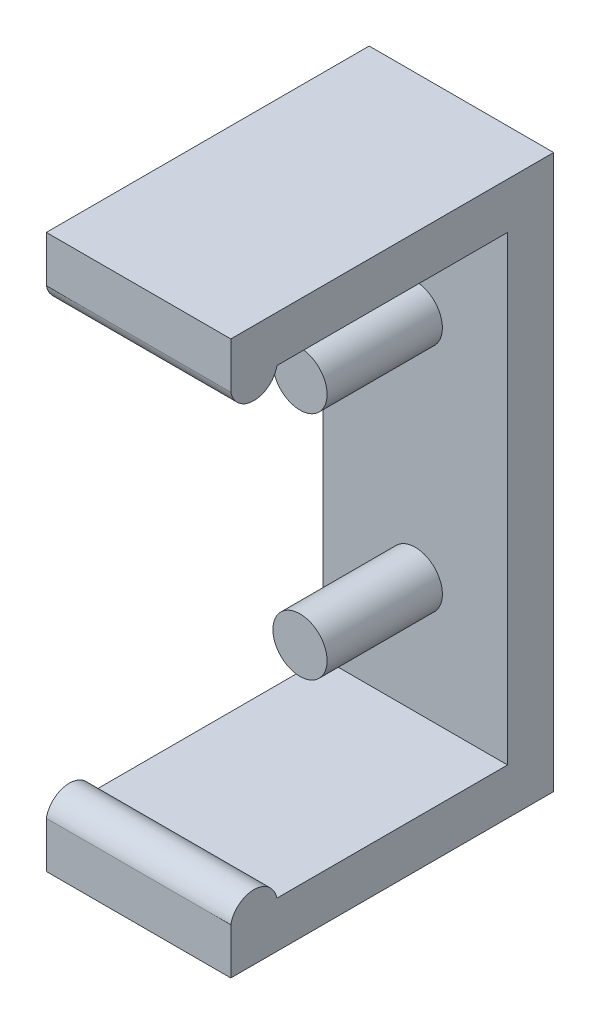
ISO-10303-21;
HEADER;
FILE_DESCRIPTION(('STEP AP214'),'2;1');
FILE_NAME('part.step','',(''),(''),'','','');
FILE_SCHEMA(('AUTOMOTIVE_DESIGN { 1 0 10303 214 1 1 1 1 }'));
ENDSEC;
DATA;
#1=APPLICATION_CONTEXT('core data for automotive mechanical design processes');
#2=APPLICATION_PROTOCOL_DEFINITION('international standard','automotive_design',2000,#1);
#3=PRODUCT_CONTEXT('',#1,'mechanical');
#4=PRODUCT('Part','Part','',(#3));
#5=PRODUCT_RELATED_PRODUCT_CATEGORY('part','',(#4));
#6=PRODUCT_DEFINITION_FORMATION('','',#4);
#7=PRODUCT_DEFINITION_CONTEXT('part definition',#1,'design');
#8=PRODUCT_DEFINITION('design','',#6,#7);
#9=PRODUCT_DEFINITION_SHAPE('','',#8);
#10=(LENGTH_UNIT() NAMED_UNIT(*) SI_UNIT(.MILLI.,.METRE.));
#11=(NAMED_UNIT(*) PLANE_ANGLE_UNIT() SI_UNIT($,.RADIAN.));
#12=(NAMED_UNIT(*) SI_UNIT($,.STERADIAN.) SOLID_ANGLE_UNIT());
#13=UNCERTAINTY_MEASURE_WITH_UNIT(LENGTH_MEASURE(1.E-05),#10,'distance_accuracy_value','');
#14=(GEOMETRIC_REPRESENTATION_CONTEXT(3) GLOBAL_UNCERTAINTY_ASSIGNED_CONTEXT((#13)) GLOBAL_UNIT_ASSIGNED_CONTEXT((#10,
#11,#12)) REPRESENTATION_CONTEXT('',''));
#15=CARTESIAN_POINT('',(0.,0.,0.));
#16=DIRECTION('',(0.,0.,1.));
#17=DIRECTION('',(1.,0.,0.));
#18=AXIS2_PLACEMENT_3D('',#15,#16,#17);
#19=CARTESIAN_POINT('',(-4.,10.,14.));
#20=DIRECTION('',(0.,1.,0.));
#21=DIRECTION('',(0.,0.,1.));
#22=AXIS2_PLACEMENT_3D('',#19,#20,#21);
#23=PLANE('',#22);
#24=DIRECTION('',(1.,0.,0.));
#25=VECTOR('',#24,1.);
#26=CARTESIAN_POINT('',(-6.16119528841294,10.,12.));
#27=LINE('',#26,#25);
#28=CARTESIAN_POINT('',(-4.,10.,12.));
#29=VERTEX_POINT('',#28);
#30=CARTESIAN_POINT('',(4.,10.,12.));
#31=VERTEX_POINT('',#30);
#32=EDGE_CURVE('E251',#29,#31,#27,.T.);
#33=ORIENTED_EDGE('',*,*,#32,.F.);
#34=DIRECTION('',(0.,0.,-1.));
#35=VECTOR('',#34,1.);
#36=CARTESIAN_POINT('',(-4.,10.,14.));
#37=LINE('',#36,#35);
#38=CARTESIAN_POINT('',(-4.,10.,2.));
#39=VERTEX_POINT('',#38);
#40=EDGE_CURVE('E63',#29,#39,#37,.T.);
#41=ORIENTED_EDGE('',*,*,#40,.T.);
#42=DIRECTION('',(1.,0.,0.));
#43=VECTOR('',#42,1.);
#44=CARTESIAN_POINT('',(-4.,10.,2.));
#45=LINE('',#44,#43);
#46=CARTESIAN_POINT('',(4.,10.,2.));
#47=VERTEX_POINT('',#46);
#48=EDGE_CURVE('E162',#39,#47,#45,.T.);
#49=ORIENTED_EDGE('',*,*,#48,.T.);
#50=DIRECTION('',(0.,0.,-1.));
#51=VECTOR('',#50,1.);
#52=CARTESIAN_POINT('',(4.,10.,14.));
#53=LINE('',#52,#51);
#54=EDGE_CURVE('E234',#31,#47,#53,.T.);
#55=ORIENTED_EDGE('',*,*,#54,.F.);
#56=EDGE_LOOP('',(#33,#41,#49,#55));
#57=FACE_BOUND('',#56,.T.);
#58=ADVANCED_FACE('F47',(#57),#23,.F.);
#59=CARTESIAN_POINT('',(4.,12.,2.));
#60=DIRECTION('',(-1.,0.,0.));
#61=DIRECTION('',(0.,-1.,0.));
#62=AXIS2_PLACEMENT_3D('',#59,#60,#61);
#63=PLANE('',#62);
#64=DIRECTION('',(0.,1.,0.));
#65=VECTOR('',#64,1.);
#66=CARTESIAN_POINT('',(4.,12.,0.));
#67=LINE('',#66,#65);
#68=CARTESIAN_POINT('',(4.,-12.,0.));
#69=VERTEX_POINT('',#68);
#70=CARTESIAN_POINT('',(4.,12.,0.));
#71=VERTEX_POINT('',#70);
#72=EDGE_CURVE('E184',#69,#71,#67,.T.);
#73=ORIENTED_EDGE('',*,*,#72,.T.);
#74=DIRECTION('',(0.,0.,-1.));
#75=VECTOR('',#74,1.);
#76=CARTESIAN_POINT('',(4.,12.,2.));
#77=LINE('',#76,#75);
#78=CARTESIAN_POINT('',(4.,12.,14.));
#79=VERTEX_POINT('',#78);
#80=EDGE_CURVE('E11',#79,#71,#77,.T.);
#81=ORIENTED_EDGE('',*,*,#80,.F.);
#82=DIRECTION('',(0.,1.,0.));
#83=VECTOR('',#82,1.);
#84=CARTESIAN_POINT('',(4.,12.,14.));
#85=LINE('',#84,#83);
#86=CARTESIAN_POINT('',(4.,10.,14.));
#87=VERTEX_POINT('',#86);
#88=EDGE_CURVE('E239',#87,#79,#85,.T.);
#89=ORIENTED_EDGE('',*,*,#88,.F.);
#90=CARTESIAN_POINT('',(4.,10.2009975124224,13.));
#91=DIRECTION('',(-1.,0.,0.));
#92=DIRECTION('',(0.,-1.,0.));
#93=AXIS2_PLACEMENT_3D('',#90,#91,#92);
#94=CIRCLE('',#93,1.02);
#95=EDGE_CURVE('E139',#31,#87,#94,.T.);
#96=ORIENTED_EDGE('',*,*,#95,.F.);
#97=ORIENTED_EDGE('',*,*,#54,.T.);
#98=DIRECTION('',(0.,1.,0.));
#99=VECTOR('',#98,1.);
#100=CARTESIAN_POINT('',(4.,12.,2.));
#101=LINE('',#100,#99);
#102=CARTESIAN_POINT('',(4.,-10.,2.));
#103=VERTEX_POINT('',#102);
#104=EDGE_CURVE('E149',#103,#47,#101,.T.);
#105=ORIENTED_EDGE('',*,*,#104,.F.);
#106=DIRECTION('',(0.,0.,-1.));
#107=VECTOR('',#106,1.);
#108=CARTESIAN_POINT('',(4.,-10.,14.));
#109=LINE('',#108,#107);
#110=CARTESIAN_POINT('',(4.,-10.,12.));
#111=VERTEX_POINT('',#110);
#112=EDGE_CURVE('E71',#111,#103,#109,.T.);
#113=ORIENTED_EDGE('',*,*,#112,.F.);
#114=CARTESIAN_POINT('',(4.,-10.2009975124224,13.));
#115=DIRECTION('',(1.,0.,0.));
#116=DIRECTION('',(0.,1.,0.));
#117=AXIS2_PLACEMENT_3D('',#114,#115,#116);
#118=CIRCLE('',#117,1.02);
#119=CARTESIAN_POINT('',(4.,-10.,14.));
#120=VERTEX_POINT('',#119);
#121=EDGE_CURVE('E129',#111,#120,#118,.T.);
#122=ORIENTED_EDGE('',*,*,#121,.T.);
#123=DIRECTION('',(0.,1.,0.));
#124=VECTOR('',#123,1.);
#125=CARTESIAN_POINT('',(4.,-12.,14.));
#126=LINE('',#125,#124);
#127=CARTESIAN_POINT('',(4.,-12.,14.));
#128=VERTEX_POINT('',#127);
#129=EDGE_CURVE('E166',#128,#120,#126,.T.);
#130=ORIENTED_EDGE('',*,*,#129,.F.);
#131=DIRECTION('',(0.,0.,-1.));
#132=VECTOR('',#131,1.);
#133=CARTESIAN_POINT('',(4.,-12.,2.));
#134=LINE('',#133,#132);
#135=EDGE_CURVE('E183',#128,#69,#134,.T.);
#136=ORIENTED_EDGE('',*,*,#135,.T.);
#137=EDGE_LOOP('',(#73,#81,#89,#96,#97,#105,#113,#122,#130,#136));
#138=FACE_BOUND('',#137,.T.);
#139=ADVANCED_FACE('F49',(#138),#63,.F.);
#140=CARTESIAN_POINT('',(-4.,12.,2.));
#141=DIRECTION('',(0.,-1.,0.));
#142=DIRECTION('',(0.,0.,-1.));
#143=AXIS2_PLACEMENT_3D('',#140,#141,#142);
#144=PLANE('',#143);
#145=DIRECTION('',(-1.,0.,0.));
#146=VECTOR('',#145,1.);
#147=CARTESIAN_POINT('',(-4.,12.,0.));
#148=LINE('',#147,#146);
#149=CARTESIAN_POINT('',(-4.,12.,0.));
#150=VERTEX_POINT('',#149);
#151=EDGE_CURVE('E187',#71,#150,#148,.T.);
#152=ORIENTED_EDGE('',*,*,#151,.T.);
#153=DIRECTION('',(0.,0.,-1.));
#154=VECTOR('',#153,1.);
#155=CARTESIAN_POINT('',(-4.,12.,2.));
#156=LINE('',#155,#154);
#157=CARTESIAN_POINT('',(-4.,12.,14.));
#158=VERTEX_POINT('',#157);
#159=EDGE_CURVE('E56',#158,#150,#156,.T.);
#160=ORIENTED_EDGE('',*,*,#159,.F.);
#161=DIRECTION('',(-1.,0.,0.));
#162=VECTOR('',#161,1.);
#163=CARTESIAN_POINT('',(-4.,12.,14.));
#164=LINE('',#163,#162);
#165=EDGE_CURVE('E232',#79,#158,#164,.T.);
#166=ORIENTED_EDGE('',*,*,#165,.F.);
#167=ORIENTED_EDGE('',*,*,#80,.T.);
#168=EDGE_LOOP('',(#152,#160,#166,#167));
#169=FACE_BOUND('',#168,.T.);
#170=ADVANCED_FACE('F306',(#169),#144,.F.);
#171=CARTESIAN_POINT('',(-4.,12.,2.));
#172=DIRECTION('',(1.,0.,0.));
#173=DIRECTION('',(0.,1.,0.));
#174=AXIS2_PLACEMENT_3D('',#171,#172,#173);
#175=PLANE('',#174);
#176=DIRECTION('',(0.,-1.,0.));
#177=VECTOR('',#176,1.);
#178=CARTESIAN_POINT('',(-4.,12.,0.));
#179=LINE('',#178,#177);
#180=CARTESIAN_POINT('',(-4.,-12.,0.));
#181=VERTEX_POINT('',#180);
#182=EDGE_CURVE('E190',#150,#181,#179,.T.);
#183=ORIENTED_EDGE('',*,*,#182,.T.);
#184=DIRECTION('',(0.,0.,-1.));
#185=VECTOR('',#184,1.);
#186=CARTESIAN_POINT('',(-4.,-12.,2.));
#187=LINE('',#186,#185);
#188=CARTESIAN_POINT('',(-4.,-12.,14.));
#189=VERTEX_POINT('',#188);
#190=EDGE_CURVE('E198',#189,#181,#187,.T.);
#191=ORIENTED_EDGE('',*,*,#190,.F.);
#192=DIRECTION('',(0.,-1.,0.));
#193=VECTOR('',#192,1.);
#194=CARTESIAN_POINT('',(-4.,-12.,14.));
#195=LINE('',#194,#193);
#196=CARTESIAN_POINT('',(-4.,-10.,14.));
#197=VERTEX_POINT('',#196);
#198=EDGE_CURVE('E163',#197,#189,#195,.T.);
#199=ORIENTED_EDGE('',*,*,#198,.F.);
#200=CARTESIAN_POINT('',(-4.,-10.2009975124224,13.));
#201=DIRECTION('',(1.,0.,0.));
#202=DIRECTION('',(0.,1.,0.));
#203=AXIS2_PLACEMENT_3D('',#200,#201,#202);
#204=CIRCLE('',#203,1.02);
#205=CARTESIAN_POINT('',(-4.,-10.,12.));
#206=VERTEX_POINT('',#205);
#207=EDGE_CURVE('E144',#197,#206,#204,.F.);
#208=ORIENTED_EDGE('',*,*,#207,.T.);
#209=DIRECTION('',(0.,0.,-1.));
#210=VECTOR('',#209,1.);
#211=CARTESIAN_POINT('',(-4.,-10.,14.));
#212=LINE('',#211,#210);
#213=CARTESIAN_POINT('',(-4.,-10.,2.));
#214=VERTEX_POINT('',#213);
#215=EDGE_CURVE('E142',#206,#214,#212,.T.);
#216=ORIENTED_EDGE('',*,*,#215,.T.);
#217=DIRECTION('',(0.,-1.,0.));
#218=VECTOR('',#217,1.);
#219=CARTESIAN_POINT('',(-4.,12.,2.));
#220=LINE('',#219,#218);
#221=EDGE_CURVE('E178',#39,#214,#220,.T.);
#222=ORIENTED_EDGE('',*,*,#221,.F.);
#223=ORIENTED_EDGE('',*,*,#40,.F.);
#224=CARTESIAN_POINT('',(-4.,10.2009975124224,13.));
#225=DIRECTION('',(1.,0.,0.));
#226=DIRECTION('',(0.,1.,0.));
#227=AXIS2_PLACEMENT_3D('',#224,#225,#226);
#228=CIRCLE('',#227,1.02);
#229=CARTESIAN_POINT('',(-4.,10.,14.));
#230=VERTEX_POINT('',#229);
#231=EDGE_CURVE('E248',#230,#29,#228,.T.);
#232=ORIENTED_EDGE('',*,*,#231,.F.);
#233=DIRECTION('',(0.,-1.,0.));
#234=VECTOR('',#233,1.);
#235=CARTESIAN_POINT('',(-4.,12.,14.));
#236=LINE('',#235,#234);
#237=EDGE_CURVE('E208',#158,#230,#236,.T.);
#238=ORIENTED_EDGE('',*,*,#237,.F.);
#239=ORIENTED_EDGE('',*,*,#159,.T.);
#240=EDGE_LOOP('',(#183,#191,#199,#208,#216,#222,#223,#232,#238,#239));
#241=FACE_BOUND('',#240,.T.);
#242=ADVANCED_FACE('F206',(#241),#175,.F.);
#243=CARTESIAN_POINT('',(-4.,-12.,2.));
#244=DIRECTION('',(0.,1.,0.));
#245=DIRECTION('',(0.,0.,1.));
#246=AXIS2_PLACEMENT_3D('',#243,#244,#245);
#247=PLANE('',#246);
#248=DIRECTION('',(1.,0.,0.));
#249=VECTOR('',#248,1.);
#250=CARTESIAN_POINT('',(-4.,-12.,0.));
#251=LINE('',#250,#249);
#252=EDGE_CURVE('E179',#181,#69,#251,.T.);
#253=ORIENTED_EDGE('',*,*,#252,.T.);
#254=ORIENTED_EDGE('',*,*,#135,.F.);
#255=DIRECTION('',(1.,0.,0.));
#256=VECTOR('',#255,1.);
#257=CARTESIAN_POINT('',(-4.,-12.,14.));
#258=LINE('',#257,#256);
#259=EDGE_CURVE('E169',#189,#128,#258,.T.);
#260=ORIENTED_EDGE('',*,*,#259,.F.);
#261=ORIENTED_EDGE('',*,*,#190,.T.);
#262=EDGE_LOOP('',(#253,#254,#260,#261));
#263=FACE_BOUND('',#262,.T.);
#264=ADVANCED_FACE('F217',(#263),#247,.F.);
#265=CARTESIAN_POINT('',(0.,0.,2.));
#266=DIRECTION('',(0.,0.,1.));
#267=DIRECTION('',(1.,0.,0.));
#268=AXIS2_PLACEMENT_3D('',#265,#266,#267);
#269=PLANE('',#268);
#270=CARTESIAN_POINT('',(0.,-5.,2.));
#271=DIRECTION('',(0.,0.,1.));
#272=DIRECTION('',(1.,0.,0.));
#273=AXIS2_PLACEMENT_3D('',#270,#271,#272);
#274=CIRCLE('',#273,1.175);
#275=CARTESIAN_POINT('',(1.175,-5.,2.));
#276=VERTEX_POINT('',#275);
#277=EDGE_CURVE('E265',#276,#276,#274,.T.);
#278=ORIENTED_EDGE('',*,*,#277,.F.);
#279=EDGE_LOOP('',(#278));
#280=FACE_BOUND('',#279,.T.);
#281=CARTESIAN_POINT('',(0.,5.,2.));
#282=DIRECTION('',(0.,0.,1.));
#283=DIRECTION('',(1.,0.,0.));
#284=AXIS2_PLACEMENT_3D('',#281,#282,#283);
#285=CIRCLE('',#284,1.175);
#286=CARTESIAN_POINT('',(1.175,5.,2.));
#287=VERTEX_POINT('',#286);
#288=EDGE_CURVE('E257',#287,#287,#285,.T.);
#289=ORIENTED_EDGE('',*,*,#288,.F.);
#290=EDGE_LOOP('',(#289));
#291=FACE_BOUND('',#290,.T.);
#292=ORIENTED_EDGE('',*,*,#48,.F.);
#293=ORIENTED_EDGE('',*,*,#221,.T.);
#294=DIRECTION('',(-1.,0.,0.));
#295=VECTOR('',#294,1.);
#296=CARTESIAN_POINT('',(-4.,-10.,2.));
#297=LINE('',#296,#295);
#298=EDGE_CURVE('E159',#103,#214,#297,.T.);
#299=ORIENTED_EDGE('',*,*,#298,.F.);
#300=ORIENTED_EDGE('',*,*,#104,.T.);
#301=EDGE_LOOP('',(#292,#293,#299,#300));
#302=FACE_BOUND('',#301,.T.);
#303=ADVANCED_FACE('F224',(#280,#291,#302),#269,.T.);
#304=CARTESIAN_POINT('',(0.,0.,0.));
#305=DIRECTION('',(0.,0.,1.));
#306=DIRECTION('',(1.,0.,0.));
#307=AXIS2_PLACEMENT_3D('',#304,#305,#306);
#308=PLANE('',#307);
#309=ORIENTED_EDGE('',*,*,#72,.F.);
#310=ORIENTED_EDGE('',*,*,#252,.F.);
#311=ORIENTED_EDGE('',*,*,#182,.F.);
#312=ORIENTED_EDGE('',*,*,#151,.F.);
#313=EDGE_LOOP('',(#309,#310,#311,#312));
#314=FACE_BOUND('',#313,.T.);
#315=ADVANCED_FACE('F215',(#314),#308,.F.);
#316=CARTESIAN_POINT('',(-4.,-10.,14.));
#317=DIRECTION('',(0.,-1.,0.));
#318=DIRECTION('',(0.,0.,-1.));
#319=AXIS2_PLACEMENT_3D('',#316,#317,#318);
#320=PLANE('',#319);
#321=ORIENTED_EDGE('',*,*,#215,.F.);
#322=DIRECTION('',(1.,0.,0.));
#323=VECTOR('',#322,1.);
#324=CARTESIAN_POINT('',(-6.16119528841294,-10.,12.));
#325=LINE('',#324,#323);
#326=EDGE_CURVE('E131',#206,#111,#325,.T.);
#327=ORIENTED_EDGE('',*,*,#326,.T.);
#328=ORIENTED_EDGE('',*,*,#112,.T.);
#329=ORIENTED_EDGE('',*,*,#298,.T.);
#330=EDGE_LOOP('',(#321,#327,#328,#329));
#331=FACE_BOUND('',#330,.T.);
#332=ADVANCED_FACE('F141',(#331),#320,.F.);
#333=CARTESIAN_POINT('',(0.,0.,14.));
#334=DIRECTION('',(0.,0.,-1.));
#335=DIRECTION('',(-1.,0.,0.));
#336=AXIS2_PLACEMENT_3D('',#333,#334,#335);
#337=PLANE('',#336);
#338=ORIENTED_EDGE('',*,*,#198,.T.);
#339=ORIENTED_EDGE('',*,*,#259,.T.);
#340=ORIENTED_EDGE('',*,*,#129,.T.);
#341=DIRECTION('',(-1.,0.,0.));
#342=VECTOR('',#341,1.);
#343=CARTESIAN_POINT('',(-4.,-10.,14.));
#344=LINE('',#343,#342);
#345=EDGE_CURVE('E134',#120,#197,#344,.T.);
#346=ORIENTED_EDGE('',*,*,#345,.T.);
#347=EDGE_LOOP('',(#338,#339,#340,#346));
#348=FACE_BOUND('',#347,.T.);
#349=ADVANCED_FACE('F220',(#348),#337,.F.);
#350=CARTESIAN_POINT('',(0.,0.,14.));
#351=DIRECTION('',(0.,0.,1.));
#352=DIRECTION('',(1.,0.,0.));
#353=AXIS2_PLACEMENT_3D('',#350,#351,#352);
#354=PLANE('',#353);
#355=ORIENTED_EDGE('',*,*,#237,.T.);
#356=DIRECTION('',(1.,0.,0.));
#357=VECTOR('',#356,1.);
#358=CARTESIAN_POINT('',(-4.,10.,14.));
#359=LINE('',#358,#357);
#360=EDGE_CURVE('E229',#230,#87,#359,.T.);
#361=ORIENTED_EDGE('',*,*,#360,.T.);
#362=ORIENTED_EDGE('',*,*,#88,.T.);
#363=ORIENTED_EDGE('',*,*,#165,.T.);
#364=EDGE_LOOP('',(#355,#361,#362,#363));
#365=FACE_BOUND('',#364,.T.);
#366=ADVANCED_FACE('F309',(#365),#354,.T.);
#367=CARTESIAN_POINT('',(-6.16119528841294,10.2009975124224,13.));
#368=DIRECTION('',(1.,0.,0.));
#369=DIRECTION('',(0.,1.,0.));
#370=AXIS2_PLACEMENT_3D('',#367,#368,#369);
#371=CYLINDRICAL_SURFACE('',#370,1.02);
#372=ORIENTED_EDGE('',*,*,#360,.F.);
#373=ORIENTED_EDGE('',*,*,#231,.T.);
#374=ORIENTED_EDGE('',*,*,#32,.T.);
#375=ORIENTED_EDGE('',*,*,#95,.T.);
#376=EDGE_LOOP('',(#372,#373,#374,#375));
#377=FACE_BOUND('',#376,.T.);
#378=ADVANCED_FACE('F297',(#377),#371,.T.);
#379=CARTESIAN_POINT('',(-6.16119528841294,-10.2009975124224,13.));
#380=DIRECTION('',(1.,0.,0.));
#381=DIRECTION('',(0.,1.,0.));
#382=AXIS2_PLACEMENT_3D('',#379,#380,#381);
#383=CYLINDRICAL_SURFACE('',#382,1.02);
#384=ORIENTED_EDGE('',*,*,#207,.F.);
#385=ORIENTED_EDGE('',*,*,#345,.F.);
#386=ORIENTED_EDGE('',*,*,#121,.F.);
#387=ORIENTED_EDGE('',*,*,#326,.F.);
#388=EDGE_LOOP('',(#384,#385,#386,#387));
#389=FACE_BOUND('',#388,.T.);
#390=ADVANCED_FACE('F130',(#389),#383,.T.);
#391=CARTESIAN_POINT('',(0.,5.,7.));
#392=DIRECTION('',(0.,0.,-1.));
#393=DIRECTION('',(-1.,0.,0.));
#394=AXIS2_PLACEMENT_3D('',#391,#392,#393);
#395=CYLINDRICAL_SURFACE('',#394,1.175);
#396=CARTESIAN_POINT('',(0.,5.,7.));
#397=DIRECTION('',(0.,0.,1.));
#398=DIRECTION('',(1.,0.,0.));
#399=AXIS2_PLACEMENT_3D('',#396,#397,#398);
#400=CIRCLE('',#399,1.175);
#401=CARTESIAN_POINT('',(1.175,5.,7.));
#402=VERTEX_POINT('',#401);
#403=EDGE_CURVE('E261',#402,#402,#400,.T.);
#404=ORIENTED_EDGE('',*,*,#403,.F.);
#405=EDGE_LOOP('',(#404));
#406=FACE_BOUND('',#405,.T.);
#407=ORIENTED_EDGE('',*,*,#288,.T.);
#408=EDGE_LOOP('',(#407));
#409=FACE_BOUND('',#408,.T.);
#410=ADVANCED_FACE('F287',(#406,#409),#395,.T.);
#411=CARTESIAN_POINT('',(0.,0.,7.));
#412=DIRECTION('',(0.,0.,1.));
#413=DIRECTION('',(1.,0.,0.));
#414=AXIS2_PLACEMENT_3D('',#411,#412,#413);
#415=PLANE('',#414);
#416=ORIENTED_EDGE('',*,*,#403,.T.);
#417=EDGE_LOOP('',(#416));
#418=FACE_BOUND('',#417,.T.);
#419=ADVANCED_FACE('F278',(#418),#415,.T.);
#420=CARTESIAN_POINT('',(0.,-5.,7.));
#421=DIRECTION('',(0.,0.,-1.));
#422=DIRECTION('',(-1.,0.,0.));
#423=AXIS2_PLACEMENT_3D('',#420,#421,#422);
#424=CYLINDRICAL_SURFACE('',#423,1.175);
#425=CARTESIAN_POINT('',(0.,-5.,7.));
#426=DIRECTION('',(0.,0.,1.));
#427=DIRECTION('',(1.,0.,0.));
#428=AXIS2_PLACEMENT_3D('',#425,#426,#427);
#429=CIRCLE('',#428,1.175);
#430=CARTESIAN_POINT('',(1.175,-5.,7.));
#431=VERTEX_POINT('',#430);
#432=EDGE_CURVE('E252',#431,#431,#429,.T.);
#433=ORIENTED_EDGE('',*,*,#432,.F.);
#434=EDGE_LOOP('',(#433));
#435=FACE_BOUND('',#434,.T.);
#436=ORIENTED_EDGE('',*,*,#277,.T.);
#437=EDGE_LOOP('',(#436));
#438=FACE_BOUND('',#437,.T.);
#439=ADVANCED_FACE('F275',(#435,#438),#424,.T.);
#440=CARTESIAN_POINT('',(0.,0.,7.));
#441=DIRECTION('',(0.,0.,1.));
#442=DIRECTION('',(1.,0.,0.));
#443=AXIS2_PLACEMENT_3D('',#440,#441,#442);
#444=PLANE('',#443);
#445=ORIENTED_EDGE('',*,*,#432,.T.);
#446=EDGE_LOOP('',(#445));
#447=FACE_BOUND('',#446,.T.);
#448=ADVANCED_FACE('F273',(#447),#444,.T.);
#449=CLOSED_SHELL('',(#58,#139,#170,#242,#264,#303,#315,#332,#349,#366,#378,#390,#410,#419,#439,#448));
#450=MANIFOLD_SOLID_BREP('B2',#449);
#451=ADVANCED_BREP_SHAPE_REPRESENTATION('',(#18,#450),#14);
#452=SHAPE_DEFINITION_REPRESENTATION(#9,#451);
ENDSEC;
END-ISO-10303-21;
